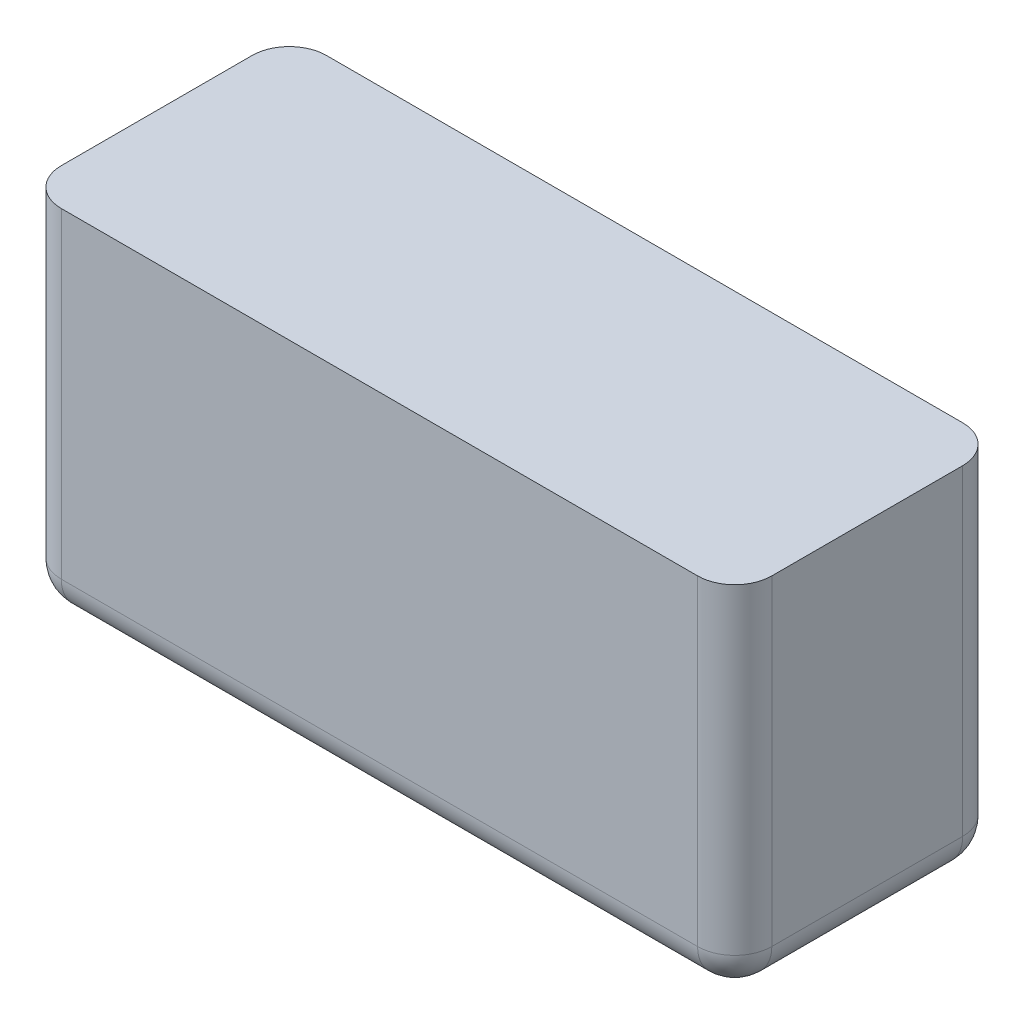
ISO-10303-21;
HEADER;
FILE_DESCRIPTION(('STEP AP214'),'2;1');
FILE_NAME('part.step','',(''),(''),'','','');
FILE_SCHEMA(('AUTOMOTIVE_DESIGN { 1 0 10303 214 1 1 1 1 }'));
ENDSEC;
DATA;
#1=APPLICATION_CONTEXT('core data for automotive mechanical design processes');
#2=APPLICATION_PROTOCOL_DEFINITION('international standard','automotive_design',2000,#1);
#3=PRODUCT_CONTEXT('',#1,'mechanical');
#4=PRODUCT('Part','Part','',(#3));
#5=PRODUCT_RELATED_PRODUCT_CATEGORY('part','',(#4));
#6=PRODUCT_DEFINITION_FORMATION('','',#4);
#7=PRODUCT_DEFINITION_CONTEXT('part definition',#1,'design');
#8=PRODUCT_DEFINITION('design','',#6,#7);
#9=PRODUCT_DEFINITION_SHAPE('','',#8);
#10=(LENGTH_UNIT() NAMED_UNIT(*) SI_UNIT(.MILLI.,.METRE.));
#11=(NAMED_UNIT(*) PLANE_ANGLE_UNIT() SI_UNIT($,.RADIAN.));
#12=(NAMED_UNIT(*) SI_UNIT($,.STERADIAN.) SOLID_ANGLE_UNIT());
#13=UNCERTAINTY_MEASURE_WITH_UNIT(LENGTH_MEASURE(1.E-05),#10,'distance_accuracy_value','');
#14=(GEOMETRIC_REPRESENTATION_CONTEXT(3) GLOBAL_UNCERTAINTY_ASSIGNED_CONTEXT((#13)) GLOBAL_UNIT_ASSIGNED_CONTEXT((#10,
#11,#12)) REPRESENTATION_CONTEXT('',''));
#15=CARTESIAN_POINT('',(0.,0.,0.));
#16=DIRECTION('',(0.,0.,1.));
#17=DIRECTION('',(1.,0.,0.));
#18=AXIS2_PLACEMENT_3D('',#15,#16,#17);
#19=CARTESIAN_POINT('',(-250.,100.,200.));
#20=DIRECTION('',(0.,-1.,0.));
#21=DIRECTION('',(0.,0.,-1.));
#22=AXIS2_PLACEMENT_3D('',#19,#20,#21);
#23=PLANE('',#22);
#24=CARTESIAN_POINT('',(-173.739296680343,100.,73.0491240052786));
#25=DIRECTION('',(0.,-1.,0.));
#26=DIRECTION('',(0.,0.,-1.));
#27=AXIS2_PLACEMENT_3D('',#24,#25,#26);
#28=CIRCLE('',#27,17.5);
#29=CARTESIAN_POINT('',(-191.239296680343,100.,73.0491240052786));
#30=VERTEX_POINT('',#29);
#31=CARTESIAN_POINT('',(-173.739296680343,100.,55.5491240052786));
#32=VERTEX_POINT('',#31);
#33=EDGE_CURVE('E11',#30,#32,#28,.T.);
#34=ORIENTED_EDGE('',*,*,#33,.F.);
#35=DIRECTION('',(0.,0.,1.));
#36=VECTOR('',#35,1.);
#37=CARTESIAN_POINT('',(-191.239296680343,100.,200.));
#38=LINE('',#37,#36);
#39=CARTESIAN_POINT('',(-191.239296680343,100.,163.049124005279));
#40=VERTEX_POINT('',#39);
#41=EDGE_CURVE('E53',#30,#40,#38,.T.);
#42=ORIENTED_EDGE('',*,*,#41,.T.);
#43=CARTESIAN_POINT('',(-173.739296680343,100.,163.049124005279));
#44=DIRECTION('',(0.,-1.,0.));
#45=DIRECTION('',(0.,0.,-1.));
#46=AXIS2_PLACEMENT_3D('',#43,#44,#45);
#47=CIRCLE('',#46,17.5);
#48=CARTESIAN_POINT('',(-173.739296680343,100.,180.549124005279));
#49=VERTEX_POINT('',#48);
#50=EDGE_CURVE('E239',#49,#40,#47,.T.);
#51=ORIENTED_EDGE('',*,*,#50,.F.);
#52=DIRECTION('',(-1.,0.,0.));
#53=VECTOR('',#52,1.);
#54=CARTESIAN_POINT('',(-250.,100.,180.549124005279));
#55=LINE('',#54,#53);
#56=CARTESIAN_POINT('',(126.260703319657,100.,180.549124005279));
#57=VERTEX_POINT('',#56);
#58=EDGE_CURVE('E228',#57,#49,#55,.T.);
#59=ORIENTED_EDGE('',*,*,#58,.F.);
#60=CARTESIAN_POINT('',(126.260703319657,100.,163.049124005279));
#61=DIRECTION('',(0.,-1.,0.));
#62=DIRECTION('',(0.,0.,-1.));
#63=AXIS2_PLACEMENT_3D('',#60,#61,#62);
#64=CIRCLE('',#63,17.5);
#65=CARTESIAN_POINT('',(143.760703319657,100.,163.049124005279));
#66=VERTEX_POINT('',#65);
#67=EDGE_CURVE('E225',#66,#57,#64,.T.);
#68=ORIENTED_EDGE('',*,*,#67,.F.);
#69=DIRECTION('',(0.,0.,-1.));
#70=VECTOR('',#69,1.);
#71=CARTESIAN_POINT('',(143.760703319657,100.,200.));
#72=LINE('',#71,#70);
#73=CARTESIAN_POINT('',(143.760703319657,100.,73.0491240052786));
#74=VERTEX_POINT('',#73);
#75=EDGE_CURVE('E232',#66,#74,#72,.T.);
#76=ORIENTED_EDGE('',*,*,#75,.T.);
#77=CARTESIAN_POINT('',(126.260703319657,100.,73.0491240052786));
#78=DIRECTION('',(0.,-1.,0.));
#79=DIRECTION('',(0.,0.,-1.));
#80=AXIS2_PLACEMENT_3D('',#77,#78,#79);
#81=CIRCLE('',#80,17.5);
#82=CARTESIAN_POINT('',(126.260703319657,100.,55.5491240052786));
#83=VERTEX_POINT('',#82);
#84=EDGE_CURVE('E236',#83,#74,#81,.T.);
#85=ORIENTED_EDGE('',*,*,#84,.F.);
#86=DIRECTION('',(-1.,0.,0.));
#87=VECTOR('',#86,1.);
#88=CARTESIAN_POINT('',(-250.,100.,55.5491240052786));
#89=LINE('',#88,#87);
#90=EDGE_CURVE('E242',#83,#32,#89,.T.);
#91=ORIENTED_EDGE('',*,*,#90,.T.);
#92=EDGE_LOOP('',(#34,#42,#51,#59,#68,#76,#85,#91));
#93=FACE_BOUND('',#92,.T.);
#94=ADVANCED_FACE('F45',(#93),#23,.F.);
#95=CARTESIAN_POINT('',(146.260703319657,-68.8520555310266,53.0491240052786));
#96=DIRECTION('',(0.,1.,0.));
#97=DIRECTION('',(0.,0.,-1.));
#98=AXIS2_PLACEMENT_3D('',#95,#96,#97);
#99=PLANE('',#98);
#100=DIRECTION('',(-1.,0.,0.));
#101=VECTOR('',#100,1.);
#102=CARTESIAN_POINT('',(146.260703319657,-68.8520555310266,73.0491240052786));
#103=LINE('',#102,#101);
#104=CARTESIAN_POINT('',(-173.739296680343,-68.8520555310266,73.0491240052786));
#105=VERTEX_POINT('',#104);
#106=CARTESIAN_POINT('',(126.260703319657,-68.8520555310266,73.0491240052786));
#107=VERTEX_POINT('',#106);
#108=EDGE_CURVE('E153',#105,#107,#103,.F.);
#109=ORIENTED_EDGE('',*,*,#108,.T.);
#110=DIRECTION('',(0.,0.,-1.));
#111=VECTOR('',#110,1.);
#112=CARTESIAN_POINT('',(126.260703319657,-68.8520555310266,53.0491240052786));
#113=LINE('',#112,#111);
#114=CARTESIAN_POINT('',(126.260703319657,-68.8520555310266,163.049124005279));
#115=VERTEX_POINT('',#114);
#116=EDGE_CURVE('E170',#107,#115,#113,.F.);
#117=ORIENTED_EDGE('',*,*,#116,.T.);
#118=DIRECTION('',(-1.,0.,0.));
#119=VECTOR('',#118,1.);
#120=CARTESIAN_POINT('',(146.260703319657,-68.8520555310266,163.049124005279));
#121=LINE('',#120,#119);
#122=CARTESIAN_POINT('',(-173.739296680343,-68.8520555310266,163.049124005279));
#123=VERTEX_POINT('',#122);
#124=EDGE_CURVE('E167',#115,#123,#121,.T.);
#125=ORIENTED_EDGE('',*,*,#124,.T.);
#126=DIRECTION('',(0.,0.,-1.));
#127=VECTOR('',#126,1.);
#128=CARTESIAN_POINT('',(-173.739296680343,-68.8520555310266,53.0491240052786));
#129=LINE('',#128,#127);
#130=EDGE_CURVE('E164',#123,#105,#129,.T.);
#131=ORIENTED_EDGE('',*,*,#130,.T.);
#132=EDGE_LOOP('',(#109,#117,#125,#131));
#133=FACE_BOUND('',#132,.T.);
#134=ADVANCED_FACE('F270',(#133),#99,.F.);
#135=CARTESIAN_POINT('',(-173.739296680343,-51.3520555310266,53.0491240052786));
#136=DIRECTION('',(0.,0.,1.));
#137=DIRECTION('',(1.,0.,0.));
#138=AXIS2_PLACEMENT_3D('',#135,#136,#137);
#139=CYLINDRICAL_SURFACE('',#138,17.5);
#140=CARTESIAN_POINT('',(-173.739296680343,-51.3520555310266,163.049124005279));
#141=DIRECTION('',(0.,0.,-1.));
#142=DIRECTION('',(0.,-1.,0.));
#143=AXIS2_PLACEMENT_3D('',#140,#141,#142);
#144=CIRCLE('',#143,17.5);
#145=CARTESIAN_POINT('',(-191.239296680343,-51.3520555310266,163.049124005279));
#146=VERTEX_POINT('',#145);
#147=EDGE_CURVE('E141',#146,#123,#144,.F.);
#148=ORIENTED_EDGE('',*,*,#147,.F.);
#149=DIRECTION('',(0.,0.,-1.));
#150=VECTOR('',#149,1.);
#151=CARTESIAN_POINT('',(-191.239296680343,-51.3520555310266,53.0491240052786));
#152=LINE('',#151,#150);
#153=CARTESIAN_POINT('',(-191.239296680343,-51.3520555310266,73.0491240052786));
#154=VERTEX_POINT('',#153);
#155=EDGE_CURVE('E125',#154,#146,#152,.F.);
#156=ORIENTED_EDGE('',*,*,#155,.F.);
#157=CARTESIAN_POINT('',(-173.739296680343,-51.3520555310266,73.0491240052786));
#158=DIRECTION('',(0.,0.,-1.));
#159=DIRECTION('',(0.,-1.,0.));
#160=AXIS2_PLACEMENT_3D('',#157,#158,#159);
#161=CIRCLE('',#160,17.5);
#162=EDGE_CURVE('E138',#105,#154,#161,.T.);
#163=ORIENTED_EDGE('',*,*,#162,.F.);
#164=ORIENTED_EDGE('',*,*,#130,.F.);
#165=EDGE_LOOP('',(#148,#156,#163,#164));
#166=FACE_BOUND('',#165,.T.);
#167=ADVANCED_FACE('F135',(#166),#139,.T.);
#168=CARTESIAN_POINT('',(126.260703319657,-51.3520555310266,53.0491240052786));
#169=DIRECTION('',(0.,0.,1.));
#170=DIRECTION('',(1.,0.,0.));
#171=AXIS2_PLACEMENT_3D('',#168,#169,#170);
#172=CYLINDRICAL_SURFACE('',#171,17.5);
#173=CARTESIAN_POINT('',(126.260703319657,-51.3520555310266,73.0491240052786));
#174=DIRECTION('',(0.,0.,1.));
#175=DIRECTION('',(1.,0.,0.));
#176=AXIS2_PLACEMENT_3D('',#173,#174,#175);
#177=CIRCLE('',#176,17.5);
#178=CARTESIAN_POINT('',(143.760703319657,-51.3520555310266,73.0491240052786));
#179=VERTEX_POINT('',#178);
#180=EDGE_CURVE('E219',#107,#179,#177,.T.);
#181=ORIENTED_EDGE('',*,*,#180,.T.);
#182=DIRECTION('',(0.,0.,1.));
#183=VECTOR('',#182,1.);
#184=CARTESIAN_POINT('',(143.760703319657,-51.3520555310266,53.0491240052786));
#185=LINE('',#184,#183);
#186=CARTESIAN_POINT('',(143.760703319657,-51.3520555310266,163.049124005279));
#187=VERTEX_POINT('',#186);
#188=EDGE_CURVE('E194',#187,#179,#185,.F.);
#189=ORIENTED_EDGE('',*,*,#188,.F.);
#190=CARTESIAN_POINT('',(126.260703319657,-51.3520555310266,163.049124005279));
#191=DIRECTION('',(0.,0.,1.));
#192=DIRECTION('',(1.,0.,0.));
#193=AXIS2_PLACEMENT_3D('',#190,#191,#192);
#194=CIRCLE('',#193,17.5);
#195=EDGE_CURVE('E220',#187,#115,#194,.F.);
#196=ORIENTED_EDGE('',*,*,#195,.T.);
#197=ORIENTED_EDGE('',*,*,#116,.F.);
#198=EDGE_LOOP('',(#181,#189,#196,#197));
#199=FACE_BOUND('',#198,.T.);
#200=ADVANCED_FACE('F309',(#199),#172,.T.);
#201=CARTESIAN_POINT('',(-23.7392966803432,-51.3520555310266,73.0491240052786));
#202=DIRECTION('',(-1.,0.,0.));
#203=DIRECTION('',(0.,0.,1.));
#204=AXIS2_PLACEMENT_3D('',#201,#202,#203);
#205=CYLINDRICAL_SURFACE('',#204,17.5);
#206=CARTESIAN_POINT('',(-173.739296680343,-51.3520555310266,73.0491240052786));
#207=DIRECTION('',(-1.,0.,0.));
#208=DIRECTION('',(0.,0.,1.));
#209=AXIS2_PLACEMENT_3D('',#206,#207,#208);
#210=CIRCLE('',#209,17.5);
#211=CARTESIAN_POINT('',(-173.739296680343,-51.3520555310266,55.5491240052786));
#212=VERTEX_POINT('',#211);
#213=EDGE_CURVE('E156',#105,#212,#210,.F.);
#214=ORIENTED_EDGE('',*,*,#213,.T.);
#215=DIRECTION('',(1.,0.,0.));
#216=VECTOR('',#215,1.);
#217=CARTESIAN_POINT('',(-23.7392966803432,-51.3520555310266,55.5491240052786));
#218=LINE('',#217,#216);
#219=CARTESIAN_POINT('',(126.260703319657,-51.3520555310266,55.5491240052786));
#220=VERTEX_POINT('',#219);
#221=EDGE_CURVE('E229',#220,#212,#218,.F.);
#222=ORIENTED_EDGE('',*,*,#221,.F.);
#223=CARTESIAN_POINT('',(126.260703319657,-51.3520555310266,73.0491240052786));
#224=DIRECTION('',(1.,0.,0.));
#225=DIRECTION('',(0.,-1.,0.));
#226=AXIS2_PLACEMENT_3D('',#223,#224,#225);
#227=CIRCLE('',#226,17.5);
#228=EDGE_CURVE('E180',#107,#220,#227,.T.);
#229=ORIENTED_EDGE('',*,*,#228,.F.);
#230=ORIENTED_EDGE('',*,*,#108,.F.);
#231=EDGE_LOOP('',(#214,#222,#229,#230));
#232=FACE_BOUND('',#231,.T.);
#233=ADVANCED_FACE('F267',(#232),#205,.T.);
#234=CARTESIAN_POINT('',(146.260703319657,-51.3520555310266,163.049124005279));
#235=DIRECTION('',(1.,0.,0.));
#236=DIRECTION('',(0.,0.,-1.));
#237=AXIS2_PLACEMENT_3D('',#234,#235,#236);
#238=CYLINDRICAL_SURFACE('',#237,17.5);
#239=CARTESIAN_POINT('',(-173.739296680343,-51.3520555310266,163.049124005279));
#240=DIRECTION('',(1.,0.,0.));
#241=DIRECTION('',(0.,0.,-1.));
#242=AXIS2_PLACEMENT_3D('',#239,#240,#241);
#243=CIRCLE('',#242,17.5);
#244=CARTESIAN_POINT('',(-173.739296680343,-51.3520555310266,180.549124005279));
#245=VERTEX_POINT('',#244);
#246=EDGE_CURVE('E179',#245,#123,#243,.T.);
#247=ORIENTED_EDGE('',*,*,#246,.T.);
#248=ORIENTED_EDGE('',*,*,#124,.F.);
#249=CARTESIAN_POINT('',(126.260703319657,-51.3520555310266,163.049124005279));
#250=DIRECTION('',(-1.,0.,0.));
#251=DIRECTION('',(0.,1.,0.));
#252=AXIS2_PLACEMENT_3D('',#249,#250,#251);
#253=CIRCLE('',#252,17.5);
#254=CARTESIAN_POINT('',(126.260703319657,-51.3520555310266,180.549124005279));
#255=VERTEX_POINT('',#254);
#256=EDGE_CURVE('E185',#255,#115,#253,.F.);
#257=ORIENTED_EDGE('',*,*,#256,.F.);
#258=DIRECTION('',(1.,0.,0.));
#259=VECTOR('',#258,1.);
#260=CARTESIAN_POINT('',(-23.7392966803432,-51.3520555310266,180.549124005279));
#261=LINE('',#260,#259);
#262=EDGE_CURVE('E199',#245,#255,#261,.T.);
#263=ORIENTED_EDGE('',*,*,#262,.F.);
#264=EDGE_LOOP('',(#247,#248,#257,#263));
#265=FACE_BOUND('',#264,.T.);
#266=ADVANCED_FACE('F279',(#265),#238,.T.);
#267=CARTESIAN_POINT('',(-173.739296680343,-51.3520555310266,73.0491240052786));
#268=DIRECTION('',(-1.,0.,0.));
#269=DIRECTION('',(0.,0.,1.));
#270=AXIS2_PLACEMENT_3D('',#267,#268,#269);
#271=SPHERICAL_SURFACE('',#270,17.5);
#272=ORIENTED_EDGE('',*,*,#162,.T.);
#273=CARTESIAN_POINT('',(-173.739296680343,-51.3520555310266,73.0491240052786));
#274=DIRECTION('',(0.,1.,0.));
#275=DIRECTION('',(0.,0.,-1.));
#276=AXIS2_PLACEMENT_3D('',#273,#274,#275);
#277=CIRCLE('',#276,17.5);
#278=EDGE_CURVE('E147',#154,#212,#277,.F.);
#279=ORIENTED_EDGE('',*,*,#278,.T.);
#280=ORIENTED_EDGE('',*,*,#213,.F.);
#281=EDGE_LOOP('',(#272,#279,#280));
#282=FACE_BOUND('',#281,.T.);
#283=ADVANCED_FACE('F155',(#282),#271,.T.);
#284=CARTESIAN_POINT('',(-173.739296680343,-51.3520555310266,163.049124005279));
#285=DIRECTION('',(-1.,0.,0.));
#286=DIRECTION('',(0.,0.,1.));
#287=AXIS2_PLACEMENT_3D('',#284,#285,#286);
#288=SPHERICAL_SURFACE('',#287,17.5);
#289=CARTESIAN_POINT('',(-173.739296680343,-51.3520555310266,163.049124005279));
#290=DIRECTION('',(0.,-1.,0.));
#291=DIRECTION('',(0.,0.,1.));
#292=AXIS2_PLACEMENT_3D('',#289,#290,#291);
#293=CIRCLE('',#292,17.5);
#294=EDGE_CURVE('E161',#245,#146,#293,.T.);
#295=ORIENTED_EDGE('',*,*,#294,.T.);
#296=ORIENTED_EDGE('',*,*,#147,.T.);
#297=ORIENTED_EDGE('',*,*,#246,.F.);
#298=EDGE_LOOP('',(#295,#296,#297));
#299=FACE_BOUND('',#298,.T.);
#300=ADVANCED_FACE('F275',(#299),#288,.T.);
#301=CARTESIAN_POINT('',(126.260703319657,-51.3520555310266,73.0491240052786));
#302=DIRECTION('',(0.,0.,-1.));
#303=DIRECTION('',(-1.,0.,0.));
#304=AXIS2_PLACEMENT_3D('',#301,#302,#303);
#305=SPHERICAL_SURFACE('',#304,17.5);
#306=ORIENTED_EDGE('',*,*,#228,.T.);
#307=CARTESIAN_POINT('',(126.260703319657,-51.3520555310266,73.0491240052786));
#308=DIRECTION('',(0.,1.,0.));
#309=DIRECTION('',(1.,0.,0.));
#310=AXIS2_PLACEMENT_3D('',#307,#308,#309);
#311=CIRCLE('',#310,17.5);
#312=EDGE_CURVE('E184',#220,#179,#311,.F.);
#313=ORIENTED_EDGE('',*,*,#312,.T.);
#314=ORIENTED_EDGE('',*,*,#180,.F.);
#315=EDGE_LOOP('',(#306,#313,#314));
#316=FACE_BOUND('',#315,.T.);
#317=ADVANCED_FACE('F323',(#316),#305,.T.);
#318=CARTESIAN_POINT('',(126.260703319657,-51.3520555310266,163.049124005279));
#319=DIRECTION('',(0.,0.,1.));
#320=DIRECTION('',(1.,0.,0.));
#321=AXIS2_PLACEMENT_3D('',#318,#319,#320);
#322=SPHERICAL_SURFACE('',#321,17.5);
#323=CARTESIAN_POINT('',(126.260703319657,-51.3520555310266,163.049124005279));
#324=DIRECTION('',(0.,-1.,0.));
#325=DIRECTION('',(0.,0.,1.));
#326=AXIS2_PLACEMENT_3D('',#323,#324,#325);
#327=CIRCLE('',#326,17.5);
#328=EDGE_CURVE('E215',#187,#255,#327,.T.);
#329=ORIENTED_EDGE('',*,*,#328,.T.);
#330=ORIENTED_EDGE('',*,*,#256,.T.);
#331=ORIENTED_EDGE('',*,*,#195,.F.);
#332=EDGE_LOOP('',(#329,#330,#331));
#333=FACE_BOUND('',#332,.T.);
#334=ADVANCED_FACE('F317',(#333),#322,.T.);
#335=CARTESIAN_POINT('',(-173.739296680343,78.6479444689734,73.0491240052786));
#336=DIRECTION('',(0.,1.,0.));
#337=DIRECTION('',(0.,0.,-1.));
#338=AXIS2_PLACEMENT_3D('',#335,#336,#337);
#339=CYLINDRICAL_SURFACE('',#338,17.5);
#340=ORIENTED_EDGE('',*,*,#33,.T.);
#341=DIRECTION('',(0.,1.,0.));
#342=VECTOR('',#341,1.);
#343=CARTESIAN_POINT('',(-173.739296680343,78.6479444689734,55.5491240052786));
#344=LINE('',#343,#342);
#345=EDGE_CURVE('E149',#212,#32,#344,.T.);
#346=ORIENTED_EDGE('',*,*,#345,.F.);
#347=ORIENTED_EDGE('',*,*,#278,.F.);
#348=DIRECTION('',(0.,1.,0.));
#349=VECTOR('',#348,1.);
#350=CARTESIAN_POINT('',(-191.239296680343,-71.3520555310266,73.0491240052786));
#351=LINE('',#350,#349);
#352=EDGE_CURVE('E121',#30,#154,#351,.F.);
#353=ORIENTED_EDGE('',*,*,#352,.F.);
#354=EDGE_LOOP('',(#340,#346,#347,#353));
#355=FACE_BOUND('',#354,.T.);
#356=ADVANCED_FACE('F148',(#355),#339,.T.);
#357=CARTESIAN_POINT('',(126.260703319657,78.6479444689734,73.0491240052786));
#358=DIRECTION('',(0.,-1.,0.));
#359=DIRECTION('',(0.,0.,1.));
#360=AXIS2_PLACEMENT_3D('',#357,#358,#359);
#361=CYLINDRICAL_SURFACE('',#360,17.5);
#362=ORIENTED_EDGE('',*,*,#84,.T.);
#363=DIRECTION('',(0.,1.,0.));
#364=VECTOR('',#363,1.);
#365=CARTESIAN_POINT('',(143.760703319657,-71.3520555310266,73.0491240052786));
#366=LINE('',#365,#364);
#367=EDGE_CURVE('E174',#179,#74,#366,.T.);
#368=ORIENTED_EDGE('',*,*,#367,.F.);
#369=ORIENTED_EDGE('',*,*,#312,.F.);
#370=DIRECTION('',(0.,1.,0.));
#371=VECTOR('',#370,1.);
#372=CARTESIAN_POINT('',(126.260703319657,78.6479444689734,55.5491240052786));
#373=LINE('',#372,#371);
#374=EDGE_CURVE('E144',#83,#220,#373,.F.);
#375=ORIENTED_EDGE('',*,*,#374,.F.);
#376=EDGE_LOOP('',(#362,#368,#369,#375));
#377=FACE_BOUND('',#376,.T.);
#378=ADVANCED_FACE('F256',(#377),#361,.T.);
#379=CARTESIAN_POINT('',(-23.7392966803432,78.6479444689734,55.5491240052786));
#380=DIRECTION('',(0.,0.,1.));
#381=DIRECTION('',(1.,0.,0.));
#382=AXIS2_PLACEMENT_3D('',#379,#380,#381);
#383=PLANE('',#382);
#384=ORIENTED_EDGE('',*,*,#374,.T.);
#385=ORIENTED_EDGE('',*,*,#221,.T.);
#386=ORIENTED_EDGE('',*,*,#345,.T.);
#387=ORIENTED_EDGE('',*,*,#90,.F.);
#388=EDGE_LOOP('',(#384,#385,#386,#387));
#389=FACE_BOUND('',#388,.T.);
#390=ADVANCED_FACE('F252',(#389),#383,.F.);
#391=CARTESIAN_POINT('',(-173.739296680343,-71.3520555310266,163.049124005279));
#392=DIRECTION('',(0.,-1.,0.));
#393=DIRECTION('',(0.,0.,1.));
#394=AXIS2_PLACEMENT_3D('',#391,#392,#393);
#395=CYLINDRICAL_SURFACE('',#394,17.5);
#396=ORIENTED_EDGE('',*,*,#50,.T.);
#397=DIRECTION('',(0.,1.,0.));
#398=VECTOR('',#397,1.);
#399=CARTESIAN_POINT('',(-191.239296680343,-71.3520555310266,163.049124005279));
#400=LINE('',#399,#398);
#401=EDGE_CURVE('E129',#146,#40,#400,.T.);
#402=ORIENTED_EDGE('',*,*,#401,.F.);
#403=ORIENTED_EDGE('',*,*,#294,.F.);
#404=DIRECTION('',(0.,1.,0.));
#405=VECTOR('',#404,1.);
#406=CARTESIAN_POINT('',(-173.739296680343,78.6479444689734,180.549124005279));
#407=LINE('',#406,#405);
#408=EDGE_CURVE('E198',#49,#245,#407,.F.);
#409=ORIENTED_EDGE('',*,*,#408,.F.);
#410=EDGE_LOOP('',(#396,#402,#403,#409));
#411=FACE_BOUND('',#410,.T.);
#412=ADVANCED_FACE('F289',(#411),#395,.T.);
#413=CARTESIAN_POINT('',(126.260703319657,-71.3520555310266,163.049124005279));
#414=DIRECTION('',(0.,1.,0.));
#415=DIRECTION('',(0.,0.,-1.));
#416=AXIS2_PLACEMENT_3D('',#413,#414,#415);
#417=CYLINDRICAL_SURFACE('',#416,17.5);
#418=ORIENTED_EDGE('',*,*,#67,.T.);
#419=DIRECTION('',(0.,1.,0.));
#420=VECTOR('',#419,1.);
#421=CARTESIAN_POINT('',(126.260703319657,78.6479444689734,180.549124005279));
#422=LINE('',#421,#420);
#423=EDGE_CURVE('E130',#255,#57,#422,.T.);
#424=ORIENTED_EDGE('',*,*,#423,.F.);
#425=ORIENTED_EDGE('',*,*,#328,.F.);
#426=DIRECTION('',(0.,1.,0.));
#427=VECTOR('',#426,1.);
#428=CARTESIAN_POINT('',(143.760703319657,-71.3520555310266,163.049124005279));
#429=LINE('',#428,#427);
#430=EDGE_CURVE('E60',#66,#187,#429,.F.);
#431=ORIENTED_EDGE('',*,*,#430,.F.);
#432=EDGE_LOOP('',(#418,#424,#425,#431));
#433=FACE_BOUND('',#432,.T.);
#434=ADVANCED_FACE('F285',(#433),#417,.T.);
#435=CARTESIAN_POINT('',(-23.7392966803432,78.6479444689734,180.549124005279));
#436=DIRECTION('',(0.,0.,1.));
#437=DIRECTION('',(1.,0.,0.));
#438=AXIS2_PLACEMENT_3D('',#435,#436,#437);
#439=PLANE('',#438);
#440=ORIENTED_EDGE('',*,*,#58,.T.);
#441=ORIENTED_EDGE('',*,*,#408,.T.);
#442=ORIENTED_EDGE('',*,*,#262,.T.);
#443=ORIENTED_EDGE('',*,*,#423,.T.);
#444=EDGE_LOOP('',(#440,#441,#442,#443));
#445=FACE_BOUND('',#444,.T.);
#446=ADVANCED_FACE('F283',(#445),#439,.T.);
#447=CARTESIAN_POINT('',(143.760703319657,-71.3520555310266,53.0491240052786));
#448=DIRECTION('',(-1.,0.,0.));
#449=DIRECTION('',(0.,0.,1.));
#450=AXIS2_PLACEMENT_3D('',#447,#448,#449);
#451=PLANE('',#450);
#452=ORIENTED_EDGE('',*,*,#430,.T.);
#453=ORIENTED_EDGE('',*,*,#188,.T.);
#454=ORIENTED_EDGE('',*,*,#367,.T.);
#455=ORIENTED_EDGE('',*,*,#75,.F.);
#456=EDGE_LOOP('',(#452,#453,#454,#455));
#457=FACE_BOUND('',#456,.T.);
#458=ADVANCED_FACE('F311',(#457),#451,.F.);
#459=CARTESIAN_POINT('',(-191.239296680343,-71.3520555310266,53.0491240052786));
#460=DIRECTION('',(1.,0.,0.));
#461=DIRECTION('',(0.,0.,-1.));
#462=AXIS2_PLACEMENT_3D('',#459,#460,#461);
#463=PLANE('',#462);
#464=ORIENTED_EDGE('',*,*,#352,.T.);
#465=ORIENTED_EDGE('',*,*,#155,.T.);
#466=ORIENTED_EDGE('',*,*,#401,.T.);
#467=ORIENTED_EDGE('',*,*,#41,.F.);
#468=EDGE_LOOP('',(#464,#465,#466,#467));
#469=FACE_BOUND('',#468,.T.);
#470=ADVANCED_FACE('F123',(#469),#463,.F.);
#471=CLOSED_SHELL('',(#94,#134,#167,#200,#233,#266,#283,#300,#317,#334,#356,#378,#390,#412,#434,
#446,#458,#470));
#472=MANIFOLD_SOLID_BREP('B2',#471);
#473=ADVANCED_BREP_SHAPE_REPRESENTATION('',(#18,#472),#14);
#474=SHAPE_DEFINITION_REPRESENTATION(#9,#473);
ENDSEC;
END-ISO-10303-21;
